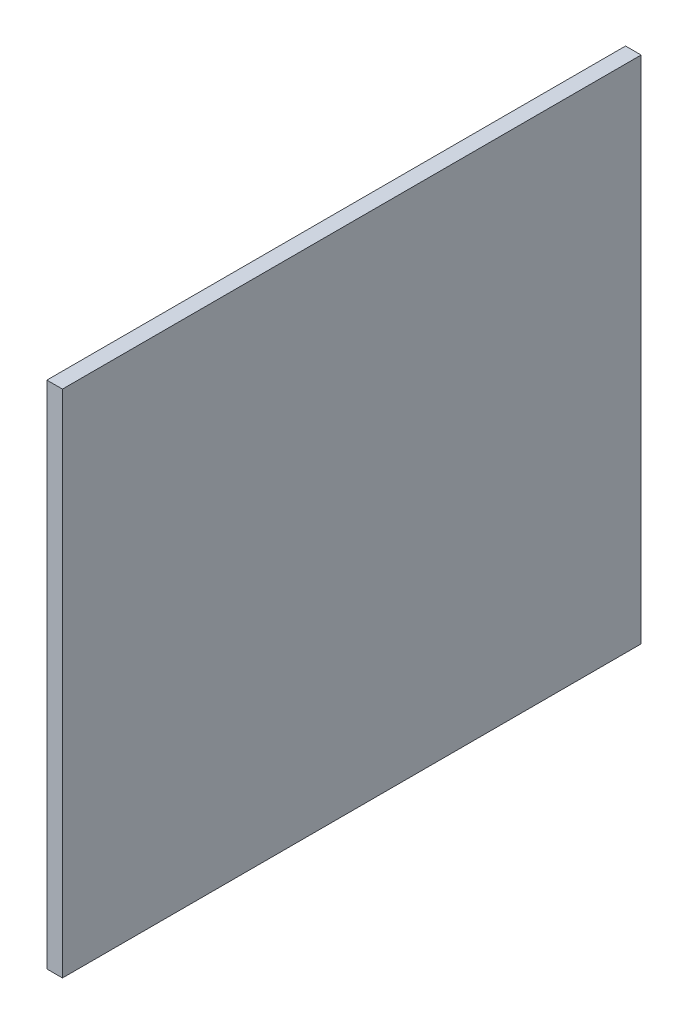
ISO-10303-21;
HEADER;
FILE_DESCRIPTION(('STEP AP214'),'2;1');
FILE_NAME('part.step','',(''),(''),'','','');
FILE_SCHEMA(('AUTOMOTIVE_DESIGN { 1 0 10303 214 1 1 1 1 }'));
ENDSEC;
DATA;
#1=APPLICATION_CONTEXT('core data for automotive mechanical design processes');
#2=APPLICATION_PROTOCOL_DEFINITION('international standard','automotive_design',2000,#1);
#3=PRODUCT_CONTEXT('',#1,'mechanical');
#4=PRODUCT('Part','Part','',(#3));
#5=PRODUCT_RELATED_PRODUCT_CATEGORY('part','',(#4));
#6=PRODUCT_DEFINITION_FORMATION('','',#4);
#7=PRODUCT_DEFINITION_CONTEXT('part definition',#1,'design');
#8=PRODUCT_DEFINITION('design','',#6,#7);
#9=PRODUCT_DEFINITION_SHAPE('','',#8);
#10=(LENGTH_UNIT() NAMED_UNIT(*) SI_UNIT(.MILLI.,.METRE.));
#11=(NAMED_UNIT(*) PLANE_ANGLE_UNIT() SI_UNIT($,.RADIAN.));
#12=(NAMED_UNIT(*) SI_UNIT($,.STERADIAN.) SOLID_ANGLE_UNIT());
#13=UNCERTAINTY_MEASURE_WITH_UNIT(LENGTH_MEASURE(1.E-05),#10,'distance_accuracy_value','');
#14=(GEOMETRIC_REPRESENTATION_CONTEXT(3) GLOBAL_UNCERTAINTY_ASSIGNED_CONTEXT((#13)) GLOBAL_UNIT_ASSIGNED_CONTEXT((#10,
#11,#12)) REPRESENTATION_CONTEXT('',''));
#15=CARTESIAN_POINT('',(0.,0.,0.));
#16=DIRECTION('',(0.,0.,1.));
#17=DIRECTION('',(1.,0.,0.));
#18=AXIS2_PLACEMENT_3D('',#15,#16,#17);
#19=CARTESIAN_POINT('',(3.175,52.,-59.));
#20=DIRECTION('',(0.,0.,1.));
#21=DIRECTION('',(1.,0.,0.));
#22=AXIS2_PLACEMENT_3D('',#19,#20,#21);
#23=PLANE('',#22);
#24=DIRECTION('',(0.,1.,0.));
#25=VECTOR('',#24,1.);
#26=CARTESIAN_POINT('',(0.,52.,-59.));
#27=LINE('',#26,#25);
#28=CARTESIAN_POINT('',(0.,-52.,-59.));
#29=VERTEX_POINT('',#28);
#30=CARTESIAN_POINT('',(0.,52.,-59.));
#31=VERTEX_POINT('',#30);
#32=EDGE_CURVE('E96',#29,#31,#27,.T.);
#33=ORIENTED_EDGE('',*,*,#32,.T.);
#34=DIRECTION('',(-1.,0.,0.));
#35=VECTOR('',#34,1.);
#36=CARTESIAN_POINT('',(3.175,52.,-59.));
#37=LINE('',#36,#35);
#38=CARTESIAN_POINT('',(3.175,52.,-59.));
#39=VERTEX_POINT('',#38);
#40=EDGE_CURVE('E11',#39,#31,#37,.T.);
#41=ORIENTED_EDGE('',*,*,#40,.F.);
#42=DIRECTION('',(0.,1.,0.));
#43=VECTOR('',#42,1.);
#44=CARTESIAN_POINT('',(3.175,52.,-59.));
#45=LINE('',#44,#43);
#46=CARTESIAN_POINT('',(3.175,-52.,-59.));
#47=VERTEX_POINT('',#46);
#48=EDGE_CURVE('E84',#47,#39,#45,.T.);
#49=ORIENTED_EDGE('',*,*,#48,.F.);
#50=DIRECTION('',(-1.,0.,0.));
#51=VECTOR('',#50,1.);
#52=CARTESIAN_POINT('',(3.175,-52.,-59.));
#53=LINE('',#52,#51);
#54=EDGE_CURVE('E92',#47,#29,#53,.T.);
#55=ORIENTED_EDGE('',*,*,#54,.T.);
#56=EDGE_LOOP('',(#33,#41,#49,#55));
#57=FACE_BOUND('',#56,.T.);
#58=ADVANCED_FACE('F33',(#57),#23,.F.);
#59=CARTESIAN_POINT('',(3.175,52.,59.));
#60=DIRECTION('',(0.,-1.,0.));
#61=DIRECTION('',(0.,0.,-1.));
#62=AXIS2_PLACEMENT_3D('',#59,#60,#61);
#63=PLANE('',#62);
#64=DIRECTION('',(0.,0.,1.));
#65=VECTOR('',#64,1.);
#66=CARTESIAN_POINT('',(0.,52.,59.));
#67=LINE('',#66,#65);
#68=CARTESIAN_POINT('',(0.,52.,59.));
#69=VERTEX_POINT('',#68);
#70=EDGE_CURVE('E88',#31,#69,#67,.T.);
#71=ORIENTED_EDGE('',*,*,#70,.T.);
#72=DIRECTION('',(-1.,0.,0.));
#73=VECTOR('',#72,1.);
#74=CARTESIAN_POINT('',(3.175,52.,59.));
#75=LINE('',#74,#73);
#76=CARTESIAN_POINT('',(3.175,52.,59.));
#77=VERTEX_POINT('',#76);
#78=EDGE_CURVE('E41',#77,#69,#75,.T.);
#79=ORIENTED_EDGE('',*,*,#78,.F.);
#80=DIRECTION('',(0.,0.,1.));
#81=VECTOR('',#80,1.);
#82=CARTESIAN_POINT('',(3.175,52.,59.));
#83=LINE('',#82,#81);
#84=EDGE_CURVE('E79',#39,#77,#83,.T.);
#85=ORIENTED_EDGE('',*,*,#84,.F.);
#86=ORIENTED_EDGE('',*,*,#40,.T.);
#87=EDGE_LOOP('',(#71,#79,#85,#86));
#88=FACE_BOUND('',#87,.T.);
#89=ADVANCED_FACE('F87',(#88),#63,.F.);
#90=CARTESIAN_POINT('',(3.175,52.,59.));
#91=DIRECTION('',(0.,0.,-1.));
#92=DIRECTION('',(-1.,0.,0.));
#93=AXIS2_PLACEMENT_3D('',#90,#91,#92);
#94=PLANE('',#93);
#95=DIRECTION('',(0.,-1.,0.));
#96=VECTOR('',#95,1.);
#97=CARTESIAN_POINT('',(0.,52.,59.));
#98=LINE('',#97,#96);
#99=CARTESIAN_POINT('',(0.,-52.,59.));
#100=VERTEX_POINT('',#99);
#101=EDGE_CURVE('E66',#69,#100,#98,.T.);
#102=ORIENTED_EDGE('',*,*,#101,.T.);
#103=DIRECTION('',(-1.,0.,0.));
#104=VECTOR('',#103,1.);
#105=CARTESIAN_POINT('',(3.175,-52.,59.));
#106=LINE('',#105,#104);
#107=CARTESIAN_POINT('',(3.175,-52.,59.));
#108=VERTEX_POINT('',#107);
#109=EDGE_CURVE('E89',#108,#100,#106,.T.);
#110=ORIENTED_EDGE('',*,*,#109,.F.);
#111=DIRECTION('',(0.,-1.,0.));
#112=VECTOR('',#111,1.);
#113=CARTESIAN_POINT('',(3.175,52.,59.));
#114=LINE('',#113,#112);
#115=EDGE_CURVE('E82',#77,#108,#114,.T.);
#116=ORIENTED_EDGE('',*,*,#115,.F.);
#117=ORIENTED_EDGE('',*,*,#78,.T.);
#118=EDGE_LOOP('',(#102,#110,#116,#117));
#119=FACE_BOUND('',#118,.T.);
#120=ADVANCED_FACE('F90',(#119),#94,.F.);
#121=CARTESIAN_POINT('',(3.175,-52.,59.));
#122=DIRECTION('',(0.,1.,0.));
#123=DIRECTION('',(0.,0.,1.));
#124=AXIS2_PLACEMENT_3D('',#121,#122,#123);
#125=PLANE('',#124);
#126=DIRECTION('',(0.,0.,-1.));
#127=VECTOR('',#126,1.);
#128=CARTESIAN_POINT('',(0.,-52.,59.));
#129=LINE('',#128,#127);
#130=EDGE_CURVE('E72',#100,#29,#129,.T.);
#131=ORIENTED_EDGE('',*,*,#130,.T.);
#132=ORIENTED_EDGE('',*,*,#54,.F.);
#133=DIRECTION('',(0.,0.,-1.));
#134=VECTOR('',#133,1.);
#135=CARTESIAN_POINT('',(3.175,-52.,59.));
#136=LINE('',#135,#134);
#137=EDGE_CURVE('E49',#108,#47,#136,.T.);
#138=ORIENTED_EDGE('',*,*,#137,.F.);
#139=ORIENTED_EDGE('',*,*,#109,.T.);
#140=EDGE_LOOP('',(#131,#132,#138,#139));
#141=FACE_BOUND('',#140,.T.);
#142=ADVANCED_FACE('F103',(#141),#125,.F.);
#143=CARTESIAN_POINT('',(3.175,0.,0.));
#144=DIRECTION('',(1.,0.,0.));
#145=DIRECTION('',(0.,0.,-1.));
#146=AXIS2_PLACEMENT_3D('',#143,#144,#145);
#147=PLANE('',#146);
#148=ORIENTED_EDGE('',*,*,#48,.T.);
#149=ORIENTED_EDGE('',*,*,#84,.T.);
#150=ORIENTED_EDGE('',*,*,#115,.T.);
#151=ORIENTED_EDGE('',*,*,#137,.T.);
#152=EDGE_LOOP('',(#148,#149,#150,#151));
#153=FACE_BOUND('',#152,.T.);
#154=ADVANCED_FACE('F80',(#153),#147,.T.);
#155=CARTESIAN_POINT('',(0.,0.,0.));
#156=DIRECTION('',(1.,0.,0.));
#157=DIRECTION('',(0.,0.,-1.));
#158=AXIS2_PLACEMENT_3D('',#155,#156,#157);
#159=PLANE('',#158);
#160=ORIENTED_EDGE('',*,*,#32,.F.);
#161=ORIENTED_EDGE('',*,*,#130,.F.);
#162=ORIENTED_EDGE('',*,*,#101,.F.);
#163=ORIENTED_EDGE('',*,*,#70,.F.);
#164=EDGE_LOOP('',(#160,#161,#162,#163));
#165=FACE_BOUND('',#164,.T.);
#166=ADVANCED_FACE('F106',(#165),#159,.F.);
#167=CLOSED_SHELL('',(#58,#89,#120,#142,#154,#166));
#168=MANIFOLD_SOLID_BREP('B2',#167);
#169=ADVANCED_BREP_SHAPE_REPRESENTATION('',(#18,#168),#14);
#170=SHAPE_DEFINITION_REPRESENTATION(#9,#169);
ENDSEC;
END-ISO-10303-21;
